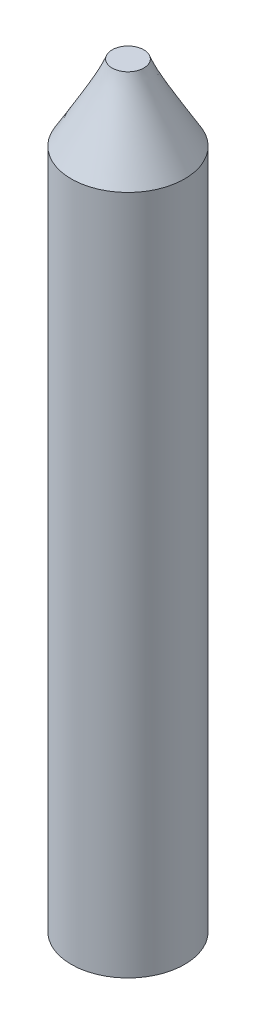
ISO-10303-21;
HEADER;
FILE_DESCRIPTION(('STEP AP214'),'2;1');
FILE_NAME('part.step','',(''),(''),'','','');
FILE_SCHEMA(('AUTOMOTIVE_DESIGN { 1 0 10303 214 1 1 1 1 }'));
ENDSEC;
DATA;
#1=APPLICATION_CONTEXT('core data for automotive mechanical design processes');
#2=APPLICATION_PROTOCOL_DEFINITION('international standard','automotive_design',2000,#1);
#3=PRODUCT_CONTEXT('',#1,'mechanical');
#4=PRODUCT('Part','Part','',(#3));
#5=PRODUCT_RELATED_PRODUCT_CATEGORY('part','',(#4));
#6=PRODUCT_DEFINITION_FORMATION('','',#4);
#7=PRODUCT_DEFINITION_CONTEXT('part definition',#1,'design');
#8=PRODUCT_DEFINITION('design','',#6,#7);
#9=PRODUCT_DEFINITION_SHAPE('','',#8);
#10=(LENGTH_UNIT() NAMED_UNIT(*) SI_UNIT(.MILLI.,.METRE.));
#11=(NAMED_UNIT(*) PLANE_ANGLE_UNIT() SI_UNIT($,.RADIAN.));
#12=(NAMED_UNIT(*) SI_UNIT($,.STERADIAN.) SOLID_ANGLE_UNIT());
#13=UNCERTAINTY_MEASURE_WITH_UNIT(LENGTH_MEASURE(1.E-05),#10,'distance_accuracy_value','');
#14=(GEOMETRIC_REPRESENTATION_CONTEXT(3) GLOBAL_UNCERTAINTY_ASSIGNED_CONTEXT((#13)) GLOBAL_UNIT_ASSIGNED_CONTEXT((#10,
#11,#12)) REPRESENTATION_CONTEXT('',''));
#15=CARTESIAN_POINT('',(0.,0.,0.));
#16=DIRECTION('',(0.,0.,1.));
#17=DIRECTION('',(1.,0.,0.));
#18=AXIS2_PLACEMENT_3D('',#15,#16,#17);
#19=CARTESIAN_POINT('',(0.,114.3,0.));
#20=DIRECTION('',(0.,-1.,0.));
#21=DIRECTION('',(0.,0.,-1.));
#22=AXIS2_PLACEMENT_3D('',#19,#20,#21);
#23=CYLINDRICAL_SURFACE('',#22,9.525);
#24=CARTESIAN_POINT('',(0.,114.3,0.));
#25=DIRECTION('',(0.,-1.,0.));
#26=DIRECTION('',(0.,0.,-1.));
#27=AXIS2_PLACEMENT_3D('',#24,#25,#26);
#28=CIRCLE('',#27,9.525);
#29=CARTESIAN_POINT('',(-5.34394023494606,114.3,-7.88466408703153));
#30=VERTEX_POINT('',#29);
#31=EDGE_CURVE('E11',#30,#30,#28,.F.);
#32=ORIENTED_EDGE('',*,*,#31,.F.);
#33=EDGE_LOOP('',(#32));
#34=FACE_BOUND('',#33,.T.);
#35=CARTESIAN_POINT('',(0.,0.,0.));
#36=DIRECTION('',(0.,1.,0.));
#37=DIRECTION('',(0.,0.,1.));
#38=AXIS2_PLACEMENT_3D('',#35,#36,#37);
#39=CIRCLE('',#38,9.525);
#40=CARTESIAN_POINT('',(0.,0.,9.525));
#41=VERTEX_POINT('',#40);
#42=EDGE_CURVE('E53',#41,#41,#39,.T.);
#43=ORIENTED_EDGE('',*,*,#42,.T.);
#44=EDGE_LOOP('',(#43));
#45=FACE_BOUND('',#44,.T.);
#46=ADVANCED_FACE('F45',(#34,#45),#23,.T.);
#47=CARTESIAN_POINT('',(0.,0.,0.));
#48=DIRECTION('',(0.,1.,0.));
#49=DIRECTION('',(0.,0.,1.));
#50=AXIS2_PLACEMENT_3D('',#47,#48,#49);
#51=PLANE('',#50);
#52=ORIENTED_EDGE('',*,*,#42,.F.);
#53=EDGE_LOOP('',(#52));
#54=FACE_BOUND('',#53,.T.);
#55=ADVANCED_FACE('F81',(#54),#51,.F.);
#56=CARTESIAN_POINT('',(0.,127.,0.));
#57=DIRECTION('',(0.,1.,0.));
#58=DIRECTION('',(0.,0.,1.));
#59=AXIS2_PLACEMENT_3D('',#56,#57,#58);
#60=PLANE('',#59);
#61=CARTESIAN_POINT('',(0.,127.,0.));
#62=DIRECTION('',(0.,1.,0.));
#63=DIRECTION('',(0.,0.,1.));
#64=AXIS2_PLACEMENT_3D('',#61,#62,#63);
#65=CIRCLE('',#64,2.65787498697973);
#66=CARTESIAN_POINT('',(0.303276570856607,127.,-2.64051562540007));
#67=VERTEX_POINT('',#66);
#68=EDGE_CURVE('E58',#67,#67,#65,.T.);
#69=ORIENTED_EDGE('',*,*,#68,.T.);
#70=EDGE_LOOP('',(#69));
#71=FACE_BOUND('',#70,.T.);
#72=ADVANCED_FACE('F71',(#71),#60,.T.);
#73=CARTESIAN_POINT('',(0.303276570856607,127.,-2.64051562540007));
#74=CARTESIAN_POINT('',(-5.34394023494606,114.3,-7.88466408703153));
#75=CARTESIAN_POINT('',(5.58430782165676,127.,-2.03396248368686));
#76=CARTESIAN_POINT('',(10.425387939117,114.3,-18.5725445569236));
#77=CARTESIAN_POINT('',(4.97775467994354,127.,3.24706876711329));
#78=CARTESIAN_POINT('',(21.1132684090091,114.3,-2.80321638286059));
#79=CARTESIAN_POINT('',(-0.303276570856608,127.,2.64051562540007));
#80=CARTESIAN_POINT('',(5.34394023494606,114.3,7.88466408703152));
#81=CARTESIAN_POINT('',(-5.58430782165675,127.,2.03396248368686));
#82=CARTESIAN_POINT('',(-10.425387939117,114.3,18.5725445569236));
#83=CARTESIAN_POINT('',(-4.97775467994354,127.,-3.24706876711329));
#84=CARTESIAN_POINT('',(-21.1132684090091,114.3,2.80321638286059));
#85=CARTESIAN_POINT('',(0.303276570856607,127.,-2.64051562540007));
#86=CARTESIAN_POINT('',(-5.34394023494606,114.3,-7.88466408703153));
#87=(BOUNDED_SURFACE() B_SPLINE_SURFACE(3,1,((#73,#74),(#75,#76),(#77,#78),(#79,#80),(#81,#82),
(#83,#84),(#85,#86)),.UNSPECIFIED.,.T.,.F.,.F.) B_SPLINE_SURFACE_WITH_KNOTS((4,3,4),(2,2),(0.,
0.5,1.),(0.,1.),.UNSPECIFIED.) GEOMETRIC_REPRESENTATION_ITEM() RATIONAL_B_SPLINE_SURFACE(((1.,
1.),(0.333333333333333,0.333333333333333),(0.333333333333333,0.333333333333333),(1.,1.),
(0.333333333333334,0.333333333333333),(0.333333333333334,0.333333333333333),(1.,1.))) REPRESENTATION_ITEM('') SURFACE());
#88=CARTESIAN_POINT('',(0.303276570856607,127.,-2.64051562540007));
#89=CARTESIAN_POINT('',(0.244451395796159,126.867708333333,-2.69514217187541));
#90=CARTESIAN_POINT('',(0.185626220735716,126.735416666667,-2.74976871835073));
#91=CARTESIAN_POINT('',(0.0679758706148297,126.470833333333,-2.85902181130138));
#92=CARTESIAN_POINT('',(0.00915069555438668,126.338541666667,-2.91364835777671));
#93=CARTESIAN_POINT('',(-0.108499654566502,126.073958333333,-3.02290145072737));
#94=CARTESIAN_POINT('',(-0.167324829626948,125.941666666667,-3.07752799720269));
#95=CARTESIAN_POINT('',(-0.284975179747837,125.677083333333,-3.18678109015335));
#96=CARTESIAN_POINT('',(-0.343800354808281,125.544791666667,-3.24140763662868));
#97=CARTESIAN_POINT('',(-0.461450704929171,125.280208333333,-3.35066072957933));
#98=CARTESIAN_POINT('',(-0.520275879989616,125.147916666667,-3.40528727605466));
#99=CARTESIAN_POINT('',(-0.637926230110505,124.883333333333,-3.51454036900532));
#100=CARTESIAN_POINT('',(-0.696751405170948,124.751041666667,-3.56916691548064));
#101=CARTESIAN_POINT('',(-0.814401755291835,124.486458333333,-3.6784200084313));
#102=CARTESIAN_POINT('',(-0.87322693035228,124.354166666667,-3.73304655490663));
#103=CARTESIAN_POINT('',(-0.99087728047317,124.089583333333,-3.84229964785728));
#104=CARTESIAN_POINT('',(-1.04970245553362,123.957291666667,-3.89692619433261));
#105=CARTESIAN_POINT('',(-1.1673528056545,123.692708333333,-4.00617928728327));
#106=CARTESIAN_POINT('',(-1.22617798071495,123.560416666667,-4.06080583375859));
#107=CARTESIAN_POINT('',(-1.34382833083584,123.295833333333,-4.17005892670925));
#108=CARTESIAN_POINT('',(-1.40265350589628,123.163541666667,-4.22468547318458));
#109=CARTESIAN_POINT('',(-1.52030385601717,122.898958333333,-4.33393856613523));
#110=CARTESIAN_POINT('',(-1.57912903107761,122.766666666667,-4.38856511261056));
#111=CARTESIAN_POINT('',(-1.6967793811985,122.502083333333,-4.49781820556121));
#112=CARTESIAN_POINT('',(-1.75560455625895,122.369791666667,-4.55244475203654));
#113=CARTESIAN_POINT('',(-1.87325490637984,122.105208333333,-4.6616978449872));
#114=CARTESIAN_POINT('',(-1.93208008144028,121.972916666667,-4.71632439146252));
#115=CARTESIAN_POINT('',(-2.04973043156117,121.708333333333,-4.82557748441318));
#116=CARTESIAN_POINT('',(-2.10855560662161,121.576041666667,-4.88020403088851));
#117=CARTESIAN_POINT('',(-2.2262059567425,121.311458333333,-4.98945712383916));
#118=CARTESIAN_POINT('',(-2.28503113180295,121.179166666667,-5.04408367031449));
#119=CARTESIAN_POINT('',(-2.40268148192384,120.914583333333,-5.15333676326514));
#120=CARTESIAN_POINT('',(-2.46150665698428,120.782291666667,-5.20796330974047));
#121=CARTESIAN_POINT('',(-2.57915700710517,120.517708333333,-5.31721640269113));
#122=CARTESIAN_POINT('',(-2.63798218216561,120.385416666667,-5.37184294916646));
#123=CARTESIAN_POINT('',(-2.7556325322865,120.120833333333,-5.48109604211711));
#124=CARTESIAN_POINT('',(-2.81445770734695,119.988541666667,-5.53572258859244));
#125=CARTESIAN_POINT('',(-2.93210805746784,119.723958333333,-5.64497568154309));
#126=CARTESIAN_POINT('',(-2.99093323252828,119.591666666667,-5.69960222801842));
#127=CARTESIAN_POINT('',(-3.10858358264917,119.327083333333,-5.80885532096908));
#128=CARTESIAN_POINT('',(-3.16740875770962,119.194791666667,-5.8634818674444));
#129=CARTESIAN_POINT('',(-3.2850591078305,118.930208333333,-5.97273496039506));
#130=CARTESIAN_POINT('',(-3.34388428289095,118.797916666667,-6.02736150687039));
#131=CARTESIAN_POINT('',(-3.46153463301184,118.533333333333,-6.13661459982104));
#132=CARTESIAN_POINT('',(-3.52035980807228,118.401041666667,-6.19124114629637));
#133=CARTESIAN_POINT('',(-3.63801015819317,118.136458333333,-6.30049423924703));
#134=CARTESIAN_POINT('',(-3.69683533325361,118.004166666667,-6.35512078572235));
#135=CARTESIAN_POINT('',(-3.8144856833745,117.739583333333,-6.46437387867301));
#136=CARTESIAN_POINT('',(-3.87331085843495,117.607291666667,-6.51900042514833));
#137=CARTESIAN_POINT('',(-3.99096120855584,117.342708333333,-6.62825351809899));
#138=CARTESIAN_POINT('',(-4.04978638361628,117.210416666667,-6.68288006457432));
#139=CARTESIAN_POINT('',(-4.16743673373717,116.945833333333,-6.79213315752497));
#140=CARTESIAN_POINT('',(-4.22626190879762,116.813541666667,-6.8467597040003));
#141=CARTESIAN_POINT('',(-4.3439122589185,116.548958333333,-6.95601279695096));
#142=CARTESIAN_POINT('',(-4.40273743397895,116.416666666667,-7.01063934342628));
#143=CARTESIAN_POINT('',(-4.52038778409984,116.152083333333,-7.11989243637694));
#144=CARTESIAN_POINT('',(-4.57921295916028,116.019791666667,-7.17451898285227));
#145=CARTESIAN_POINT('',(-4.69686330928117,115.755208333333,-7.28377207580292));
#146=CARTESIAN_POINT('',(-4.75568848434161,115.622916666667,-7.33839862227825));
#147=CARTESIAN_POINT('',(-4.8733388344625,115.358333333333,-7.4476517152289));
#148=CARTESIAN_POINT('',(-4.93216400952295,115.226041666667,-7.50227826170423));
#149=CARTESIAN_POINT('',(-5.04981435964384,114.961458333333,-7.61153135465489));
#150=CARTESIAN_POINT('',(-5.10863953470428,114.829166666667,-7.66615790113022));
#151=CARTESIAN_POINT('',(-5.22628988482517,114.564583333333,-7.77541099408087));
#152=CARTESIAN_POINT('',(-5.28511505988562,114.432291666667,-7.8300375405562));
#153=CARTESIAN_POINT('',(-5.34394023494606,114.3,-7.88466408703153));
#154=B_SPLINE_CURVE_WITH_KNOTS('',3,(#88,#89,#90,#91,#92,#93,#94,#95,#96,#97,#98,#99,#100,#101,
#102,#103,#104,#105,#106,#107,#108,#109,#110,#111,#112,#113,#114,#115,#116,#117,#118,#119,#120,
#121,#122,#123,#124,#125,#126,#127,#128,#129,#130,#131,#132,#133,#134,#135,#136,#137,#138,#139,
#140,#141,#142,#143,#144,#145,#146,#147,#148,#149,#150,#151,#152,#153),.UNSPECIFIED.,.F.,.F.,(4,
2,2,2,2,2,2,2,2,2,2,2,2,2,2,2,2,2,2,2,2,2,2,2,2,2,2,2,2,2,2,2,4),(0.,0.464230452287881,
0.928460904575785,1.39269135686367,1.85692180915155,2.32115226143943,2.78538271372733,
3.24961316601523,3.71384361830311,4.178074070591,4.64230452287888,5.10653497516679,
5.57076542745467,6.03499587974255,6.49922633203044,6.96345678431833,7.42768723660621,
7.89191768889411,8.356148141182,8.82037859346988,9.28460904575777,9.74883949804566,
10.2130699503335,10.6773004026214,11.1415308549093,11.6057613071972,12.0699917594851,
12.534222211773,12.9984526640609,13.4626831163488,13.9269135686367,14.3911440209245,
14.8553744732124),.UNSPECIFIED.);
#155=EDGE_CURVE('BSEAM80',#67,#30,#154,.T.);
#156=ORIENTED_EDGE('',*,*,#68,.F.);
#157=ORIENTED_EDGE('',*,*,#31,.T.);
#158=ORIENTED_EDGE('',*,*,#155,.T.);
#159=ORIENTED_EDGE('',*,*,#155,.F.);
#160=EDGE_LOOP('',(#156,#158,#157,#159));
#161=FACE_BOUND('',#160,.T.);
#162=ADVANCED_FACE('F80',(#161),#87,.T.);
#163=CLOSED_SHELL('',(#46,#55,#72,#162));
#164=MANIFOLD_SOLID_BREP('B2',#163);
#165=ADVANCED_BREP_SHAPE_REPRESENTATION('',(#18,#164),#14);
#166=SHAPE_DEFINITION_REPRESENTATION(#9,#165);
ENDSEC;
END-ISO-10303-21;
